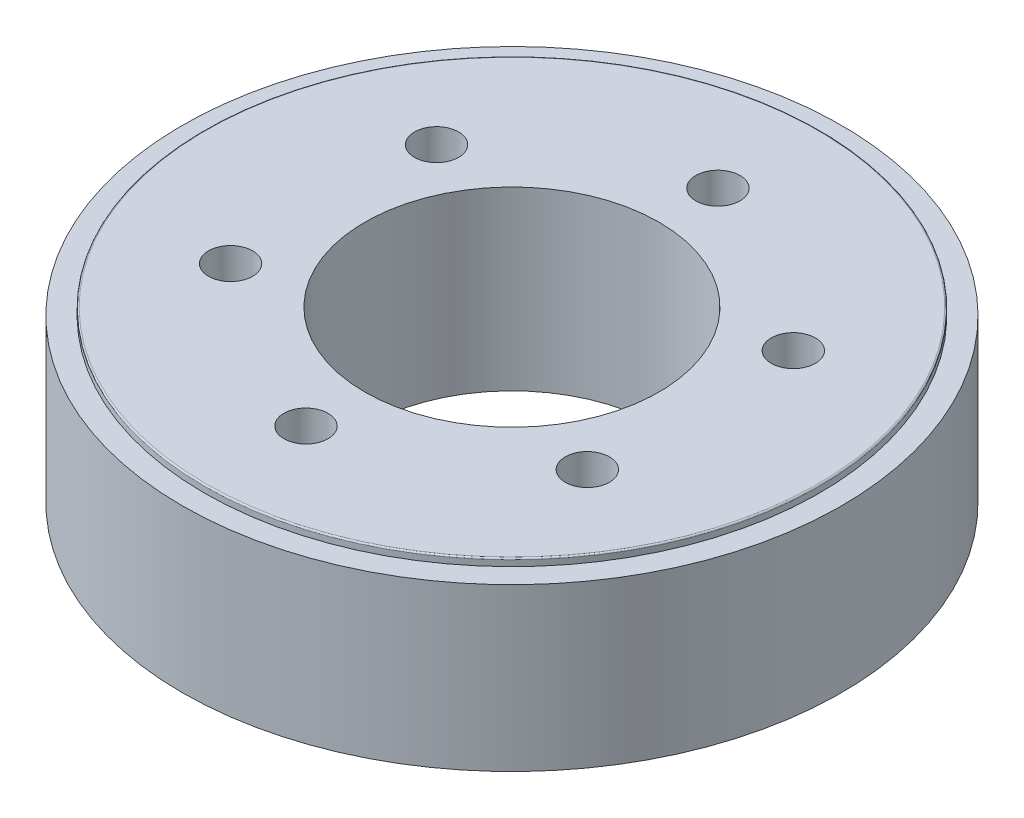
ISO-10303-21;
HEADER;
FILE_DESCRIPTION(('STEP AP214'),'2;1');
FILE_NAME('part.step','',(''),(''),'','','');
FILE_SCHEMA(('AUTOMOTIVE_DESIGN { 1 0 10303 214 1 1 1 1 }'));
ENDSEC;
DATA;
#1=APPLICATION_CONTEXT('core data for automotive mechanical design processes');
#2=APPLICATION_PROTOCOL_DEFINITION('international standard','automotive_design',2000,#1);
#3=PRODUCT_CONTEXT('',#1,'mechanical');
#4=PRODUCT('Part','Part','',(#3));
#5=PRODUCT_RELATED_PRODUCT_CATEGORY('part','',(#4));
#6=PRODUCT_DEFINITION_FORMATION('','',#4);
#7=PRODUCT_DEFINITION_CONTEXT('part definition',#1,'design');
#8=PRODUCT_DEFINITION('design','',#6,#7);
#9=PRODUCT_DEFINITION_SHAPE('','',#8);
#10=(LENGTH_UNIT() NAMED_UNIT(*) SI_UNIT(.MILLI.,.METRE.));
#11=(NAMED_UNIT(*) PLANE_ANGLE_UNIT() SI_UNIT($,.RADIAN.));
#12=(NAMED_UNIT(*) SI_UNIT($,.STERADIAN.) SOLID_ANGLE_UNIT());
#13=UNCERTAINTY_MEASURE_WITH_UNIT(LENGTH_MEASURE(1.E-05),#10,'distance_accuracy_value','');
#14=(GEOMETRIC_REPRESENTATION_CONTEXT(3) GLOBAL_UNCERTAINTY_ASSIGNED_CONTEXT((#13)) GLOBAL_UNIT_ASSIGNED_CONTEXT((#10,
#11,#12)) REPRESENTATION_CONTEXT('',''));
#15=CARTESIAN_POINT('',(0.,0.,0.));
#16=DIRECTION('',(0.,0.,1.));
#17=DIRECTION('',(1.,0.,0.));
#18=AXIS2_PLACEMENT_3D('',#15,#16,#17);
#19=CARTESIAN_POINT('',(0.,12.,0.));
#20=DIRECTION('',(0.,-1.,0.));
#21=DIRECTION('',(0.,0.,-1.));
#22=AXIS2_PLACEMENT_3D('',#19,#20,#21);
#23=CYLINDRICAL_SURFACE('',#22,22.4);
#24=CARTESIAN_POINT('',(0.,11.5,0.));
#25=DIRECTION('',(0.,1.,0.));
#26=DIRECTION('',(0.,0.,1.));
#27=AXIS2_PLACEMENT_3D('',#24,#25,#26);
#28=CIRCLE('',#27,22.4);
#29=CARTESIAN_POINT('',(0.,11.5,22.4));
#30=VERTEX_POINT('',#29);
#31=EDGE_CURVE('E63',#30,#30,#28,.T.);
#32=ORIENTED_EDGE('',*,*,#31,.F.);
#33=EDGE_LOOP('',(#32));
#34=FACE_BOUND('',#33,.T.);
#35=CARTESIAN_POINT('',(0.,0.5,0.));
#36=DIRECTION('',(0.,1.,0.));
#37=DIRECTION('',(0.,0.,1.));
#38=AXIS2_PLACEMENT_3D('',#35,#36,#37);
#39=CIRCLE('',#38,22.4);
#40=CARTESIAN_POINT('',(0.,0.5,22.4));
#41=VERTEX_POINT('',#40);
#42=EDGE_CURVE('E71',#41,#41,#39,.T.);
#43=ORIENTED_EDGE('',*,*,#42,.T.);
#44=EDGE_LOOP('',(#43));
#45=FACE_BOUND('',#44,.T.);
#46=ADVANCED_FACE('F39',(#34,#45),#23,.T.);
#47=CARTESIAN_POINT('',(0.,0.,0.));
#48=DIRECTION('',(0.,1.,0.));
#49=DIRECTION('',(0.,0.,1.));
#50=AXIS2_PLACEMENT_3D('',#47,#48,#49);
#51=PLANE('',#50);
#52=CARTESIAN_POINT('',(0.,0.,-14.));
#53=DIRECTION('',(0.,1.,0.));
#54=DIRECTION('',(0.,0.,1.));
#55=AXIS2_PLACEMENT_3D('',#52,#53,#54);
#56=CIRCLE('',#55,1.5);
#57=CARTESIAN_POINT('',(0.,0.,-12.5));
#58=VERTEX_POINT('',#57);
#59=EDGE_CURVE('E77',#58,#58,#56,.F.);
#60=ORIENTED_EDGE('',*,*,#59,.F.);
#61=EDGE_LOOP('',(#60));
#62=FACE_BOUND('',#61,.T.);
#63=CARTESIAN_POINT('',(12.1243556529822,0.,-6.99999999999997));
#64=DIRECTION('',(0.,1.,0.));
#65=DIRECTION('',(0.,0.,1.));
#66=AXIS2_PLACEMENT_3D('',#63,#64,#65);
#67=CIRCLE('',#66,1.5);
#68=CARTESIAN_POINT('',(12.1243556529822,0.,-5.49999999999998));
#69=VERTEX_POINT('',#68);
#70=EDGE_CURVE('E106',#69,#69,#67,.F.);
#71=ORIENTED_EDGE('',*,*,#70,.F.);
#72=EDGE_LOOP('',(#71));
#73=FACE_BOUND('',#72,.T.);
#74=CARTESIAN_POINT('',(12.1243556529821,0.,7.00000000000006));
#75=DIRECTION('',(0.,1.,0.));
#76=DIRECTION('',(0.,0.,1.));
#77=AXIS2_PLACEMENT_3D('',#74,#75,#76);
#78=CIRCLE('',#77,1.5);
#79=CARTESIAN_POINT('',(12.1243556529821,0.,8.50000000000006));
#80=VERTEX_POINT('',#79);
#81=EDGE_CURVE('E82',#80,#80,#78,.F.);
#82=ORIENTED_EDGE('',*,*,#81,.F.);
#83=EDGE_LOOP('',(#82));
#84=FACE_BOUND('',#83,.T.);
#85=CARTESIAN_POINT('',(0.,0.,14.));
#86=DIRECTION('',(0.,1.,0.));
#87=DIRECTION('',(0.,0.,1.));
#88=AXIS2_PLACEMENT_3D('',#85,#86,#87);
#89=CIRCLE('',#88,1.5);
#90=CARTESIAN_POINT('',(0.,0.,15.5));
#91=VERTEX_POINT('',#90);
#92=EDGE_CURVE('E81',#91,#91,#89,.F.);
#93=ORIENTED_EDGE('',*,*,#92,.F.);
#94=EDGE_LOOP('',(#93));
#95=FACE_BOUND('',#94,.T.);
#96=CARTESIAN_POINT('',(-12.1243556529822,0.,6.99999999999989));
#97=DIRECTION('',(0.,1.,0.));
#98=DIRECTION('',(0.,0.,1.));
#99=AXIS2_PLACEMENT_3D('',#96,#97,#98);
#100=CIRCLE('',#99,1.5);
#101=CARTESIAN_POINT('',(-12.1243556529822,0.,8.49999999999989));
#102=VERTEX_POINT('',#101);
#103=EDGE_CURVE('E89',#102,#102,#100,.F.);
#104=ORIENTED_EDGE('',*,*,#103,.F.);
#105=EDGE_LOOP('',(#104));
#106=FACE_BOUND('',#105,.T.);
#107=CARTESIAN_POINT('',(-12.1243556529821,0.,-7.00000000000014));
#108=DIRECTION('',(0.,1.,0.));
#109=DIRECTION('',(0.,0.,1.));
#110=AXIS2_PLACEMENT_3D('',#107,#108,#109);
#111=CIRCLE('',#110,1.5);
#112=CARTESIAN_POINT('',(-12.1243556529821,0.,-5.50000000000014));
#113=VERTEX_POINT('',#112);
#114=EDGE_CURVE('E95',#113,#113,#111,.F.);
#115=ORIENTED_EDGE('',*,*,#114,.F.);
#116=EDGE_LOOP('',(#115));
#117=FACE_BOUND('',#116,.T.);
#118=CARTESIAN_POINT('',(0.,0.,0.));
#119=DIRECTION('',(0.,1.,0.));
#120=DIRECTION('',(0.,0.,1.));
#121=AXIS2_PLACEMENT_3D('',#118,#119,#120);
#122=CIRCLE('',#121,20.8);
#123=CARTESIAN_POINT('',(0.,0.,20.8));
#124=VERTEX_POINT('',#123);
#125=EDGE_CURVE('E10',#124,#124,#122,.F.);
#126=ORIENTED_EDGE('',*,*,#125,.T.);
#127=EDGE_LOOP('',(#126));
#128=FACE_BOUND('',#127,.T.);
#129=CARTESIAN_POINT('',(0.,0.,0.));
#130=DIRECTION('',(0.,1.,0.));
#131=DIRECTION('',(0.,0.,1.));
#132=AXIS2_PLACEMENT_3D('',#129,#130,#131);
#133=CIRCLE('',#132,10.);
#134=CARTESIAN_POINT('',(0.,0.,10.));
#135=VERTEX_POINT('',#134);
#136=EDGE_CURVE('E60',#135,#135,#133,.T.);
#137=ORIENTED_EDGE('',*,*,#136,.T.);
#138=EDGE_LOOP('',(#137));
#139=FACE_BOUND('',#138,.T.);
#140=ADVANCED_FACE('F120',(#62,#73,#84,#95,#106,#117,#128,#139),#51,.F.);
#141=CARTESIAN_POINT('',(0.,12.,0.));
#142=DIRECTION('',(0.,1.,0.));
#143=DIRECTION('',(0.,0.,1.));
#144=AXIS2_PLACEMENT_3D('',#141,#142,#143);
#145=PLANE('',#144);
#146=CARTESIAN_POINT('',(0.,12.,-14.));
#147=DIRECTION('',(0.,1.,0.));
#148=DIRECTION('',(0.,0.,1.));
#149=AXIS2_PLACEMENT_3D('',#146,#147,#148);
#150=CIRCLE('',#149,1.5);
#151=CARTESIAN_POINT('',(0.,12.,-12.5));
#152=VERTEX_POINT('',#151);
#153=EDGE_CURVE('E101',#152,#152,#150,.T.);
#154=ORIENTED_EDGE('',*,*,#153,.F.);
#155=EDGE_LOOP('',(#154));
#156=FACE_BOUND('',#155,.T.);
#157=CARTESIAN_POINT('',(12.1243556529822,12.,-6.99999999999997));
#158=DIRECTION('',(0.,1.,0.));
#159=DIRECTION('',(0.,0.,1.));
#160=AXIS2_PLACEMENT_3D('',#157,#158,#159);
#161=CIRCLE('',#160,1.5);
#162=CARTESIAN_POINT('',(12.1243556529822,12.,-5.49999999999998));
#163=VERTEX_POINT('',#162);
#164=EDGE_CURVE('E85',#163,#163,#161,.T.);
#165=ORIENTED_EDGE('',*,*,#164,.F.);
#166=EDGE_LOOP('',(#165));
#167=FACE_BOUND('',#166,.T.);
#168=CARTESIAN_POINT('',(12.1243556529821,12.,7.00000000000006));
#169=DIRECTION('',(0.,1.,0.));
#170=DIRECTION('',(0.,0.,1.));
#171=AXIS2_PLACEMENT_3D('',#168,#169,#170);
#172=CIRCLE('',#171,1.5);
#173=CARTESIAN_POINT('',(12.1243556529821,12.,8.50000000000006));
#174=VERTEX_POINT('',#173);
#175=EDGE_CURVE('E78',#174,#174,#172,.T.);
#176=ORIENTED_EDGE('',*,*,#175,.F.);
#177=EDGE_LOOP('',(#176));
#178=FACE_BOUND('',#177,.T.);
#179=CARTESIAN_POINT('',(0.,12.,14.));
#180=DIRECTION('',(0.,1.,0.));
#181=DIRECTION('',(0.,0.,1.));
#182=AXIS2_PLACEMENT_3D('',#179,#180,#181);
#183=CIRCLE('',#182,1.5);
#184=CARTESIAN_POINT('',(0.,12.,15.5));
#185=VERTEX_POINT('',#184);
#186=EDGE_CURVE('E86',#185,#185,#183,.T.);
#187=ORIENTED_EDGE('',*,*,#186,.F.);
#188=EDGE_LOOP('',(#187));
#189=FACE_BOUND('',#188,.T.);
#190=CARTESIAN_POINT('',(-12.1243556529822,12.,6.99999999999989));
#191=DIRECTION('',(0.,1.,0.));
#192=DIRECTION('',(0.,0.,1.));
#193=AXIS2_PLACEMENT_3D('',#190,#191,#192);
#194=CIRCLE('',#193,1.5);
#195=CARTESIAN_POINT('',(-12.1243556529822,12.,8.49999999999989));
#196=VERTEX_POINT('',#195);
#197=EDGE_CURVE('E92',#196,#196,#194,.T.);
#198=ORIENTED_EDGE('',*,*,#197,.F.);
#199=EDGE_LOOP('',(#198));
#200=FACE_BOUND('',#199,.T.);
#201=CARTESIAN_POINT('',(-12.1243556529821,12.,-7.00000000000014));
#202=DIRECTION('',(0.,1.,0.));
#203=DIRECTION('',(0.,0.,1.));
#204=AXIS2_PLACEMENT_3D('',#201,#202,#203);
#205=CIRCLE('',#204,1.5);
#206=CARTESIAN_POINT('',(-12.1243556529821,12.,-5.50000000000014));
#207=VERTEX_POINT('',#206);
#208=EDGE_CURVE('E98',#207,#207,#205,.T.);
#209=ORIENTED_EDGE('',*,*,#208,.F.);
#210=EDGE_LOOP('',(#209));
#211=FACE_BOUND('',#210,.T.);
#212=CARTESIAN_POINT('',(0.,12.,0.));
#213=DIRECTION('',(0.,1.,0.));
#214=DIRECTION('',(0.,0.,1.));
#215=AXIS2_PLACEMENT_3D('',#212,#213,#214);
#216=CIRCLE('',#215,20.8);
#217=CARTESIAN_POINT('',(0.,12.,20.8));
#218=VERTEX_POINT('',#217);
#219=EDGE_CURVE('E54',#218,#218,#216,.T.);
#220=ORIENTED_EDGE('',*,*,#219,.T.);
#221=EDGE_LOOP('',(#220));
#222=FACE_BOUND('',#221,.T.);
#223=CARTESIAN_POINT('',(0.,12.,0.));
#224=DIRECTION('',(0.,1.,0.));
#225=DIRECTION('',(0.,0.,1.));
#226=AXIS2_PLACEMENT_3D('',#223,#224,#225);
#227=CIRCLE('',#226,10.);
#228=CARTESIAN_POINT('',(0.,12.,10.));
#229=VERTEX_POINT('',#228);
#230=EDGE_CURVE('E59',#229,#229,#227,.T.);
#231=ORIENTED_EDGE('',*,*,#230,.F.);
#232=EDGE_LOOP('',(#231));
#233=FACE_BOUND('',#232,.T.);
#234=ADVANCED_FACE('F116',(#156,#167,#178,#189,#200,#211,#222,#233),#145,.T.);
#235=CARTESIAN_POINT('',(0.,12.,0.));
#236=DIRECTION('',(0.,-1.,0.));
#237=DIRECTION('',(0.,0.,-1.));
#238=AXIS2_PLACEMENT_3D('',#235,#236,#237);
#239=CYLINDRICAL_SURFACE('',#238,10.);
#240=ORIENTED_EDGE('',*,*,#230,.T.);
#241=EDGE_LOOP('',(#240));
#242=FACE_BOUND('',#241,.T.);
#243=ORIENTED_EDGE('',*,*,#136,.F.);
#244=EDGE_LOOP('',(#243));
#245=FACE_BOUND('',#244,.T.);
#246=ADVANCED_FACE('F119',(#242,#245),#239,.F.);
#247=CARTESIAN_POINT('',(0.,11.5,0.));
#248=DIRECTION('',(0.,1.,0.));
#249=DIRECTION('',(0.,0.,1.));
#250=AXIS2_PLACEMENT_3D('',#247,#248,#249);
#251=PLANE('',#250);
#252=CARTESIAN_POINT('',(0.,11.5,0.));
#253=DIRECTION('',(0.,1.,0.));
#254=DIRECTION('',(0.,0.,1.));
#255=AXIS2_PLACEMENT_3D('',#252,#253,#254);
#256=CIRCLE('',#255,20.9);
#257=CARTESIAN_POINT('',(0.,11.5,20.9));
#258=VERTEX_POINT('',#257);
#259=EDGE_CURVE('E68',#258,#258,#256,.T.);
#260=ORIENTED_EDGE('',*,*,#259,.F.);
#261=EDGE_LOOP('',(#260));
#262=FACE_BOUND('',#261,.T.);
#263=ORIENTED_EDGE('',*,*,#31,.T.);
#264=EDGE_LOOP('',(#263));
#265=FACE_BOUND('',#264,.T.);
#266=ADVANCED_FACE('F138',(#262,#265),#251,.T.);
#267=CARTESIAN_POINT('',(0.,11.5,0.));
#268=DIRECTION('',(0.,1.,0.));
#269=DIRECTION('',(0.,0.,1.));
#270=AXIS2_PLACEMENT_3D('',#267,#268,#269);
#271=CYLINDRICAL_SURFACE('',#270,20.9);
#272=CARTESIAN_POINT('',(0.,11.9,0.));
#273=DIRECTION('',(0.,1.,0.));
#274=DIRECTION('',(0.,0.,1.));
#275=AXIS2_PLACEMENT_3D('',#272,#273,#274);
#276=CIRCLE('',#275,20.9);
#277=CARTESIAN_POINT('',(0.,11.9,20.9));
#278=VERTEX_POINT('',#277);
#279=EDGE_CURVE('E50',#278,#278,#276,.F.);
#280=ORIENTED_EDGE('',*,*,#279,.T.);
#281=EDGE_LOOP('',(#280));
#282=FACE_BOUND('',#281,.T.);
#283=ORIENTED_EDGE('',*,*,#259,.T.);
#284=EDGE_LOOP('',(#283));
#285=FACE_BOUND('',#284,.T.);
#286=ADVANCED_FACE('F156',(#282,#285),#271,.T.);
#287=CARTESIAN_POINT('',(0.,11.9,0.));
#288=DIRECTION('',(0.,1.,0.));
#289=DIRECTION('',(0.,0.,1.));
#290=AXIS2_PLACEMENT_3D('',#287,#288,#289);
#291=TOROIDAL_SURFACE('',#290,20.8,0.1);
#292=ORIENTED_EDGE('',*,*,#279,.F.);
#293=EDGE_LOOP('',(#292));
#294=FACE_BOUND('',#293,.T.);
#295=ORIENTED_EDGE('',*,*,#219,.F.);
#296=EDGE_LOOP('',(#295));
#297=FACE_BOUND('',#296,.T.);
#298=ADVANCED_FACE('F153',(#294,#297),#291,.T.);
#299=CARTESIAN_POINT('',(0.,0.5,0.));
#300=DIRECTION('',(0.,-1.,0.));
#301=DIRECTION('',(0.,0.,1.));
#302=AXIS2_PLACEMENT_3D('',#299,#300,#301);
#303=PLANE('',#302);
#304=ORIENTED_EDGE('',*,*,#42,.F.);
#305=EDGE_LOOP('',(#304));
#306=FACE_BOUND('',#305,.T.);
#307=CARTESIAN_POINT('',(0.,0.5,0.));
#308=DIRECTION('',(0.,1.,0.));
#309=DIRECTION('',(0.,0.,1.));
#310=AXIS2_PLACEMENT_3D('',#307,#308,#309);
#311=CIRCLE('',#310,20.9);
#312=CARTESIAN_POINT('',(0.,0.5,20.9));
#313=VERTEX_POINT('',#312);
#314=EDGE_CURVE('E74',#313,#313,#311,.T.);
#315=ORIENTED_EDGE('',*,*,#314,.T.);
#316=EDGE_LOOP('',(#315));
#317=FACE_BOUND('',#316,.T.);
#318=ADVANCED_FACE('F155',(#306,#317),#303,.T.);
#319=CARTESIAN_POINT('',(0.,0.5,0.));
#320=DIRECTION('',(0.,-1.,0.));
#321=DIRECTION('',(0.,0.,-1.));
#322=AXIS2_PLACEMENT_3D('',#319,#320,#321);
#323=CYLINDRICAL_SURFACE('',#322,20.9);
#324=CARTESIAN_POINT('',(0.,0.1,0.));
#325=DIRECTION('',(0.,1.,0.));
#326=DIRECTION('',(0.,0.,1.));
#327=AXIS2_PLACEMENT_3D('',#324,#325,#326);
#328=CIRCLE('',#327,20.9);
#329=CARTESIAN_POINT('',(0.,0.1,20.9));
#330=VERTEX_POINT('',#329);
#331=EDGE_CURVE('E46',#330,#330,#328,.T.);
#332=ORIENTED_EDGE('',*,*,#331,.T.);
#333=EDGE_LOOP('',(#332));
#334=FACE_BOUND('',#333,.T.);
#335=ORIENTED_EDGE('',*,*,#314,.F.);
#336=EDGE_LOOP('',(#335));
#337=FACE_BOUND('',#336,.T.);
#338=ADVANCED_FACE('F162',(#334,#337),#323,.T.);
#339=CARTESIAN_POINT('',(0.,0.1,0.));
#340=DIRECTION('',(0.,1.,0.));
#341=DIRECTION('',(0.,0.,1.));
#342=AXIS2_PLACEMENT_3D('',#339,#340,#341);
#343=TOROIDAL_SURFACE('',#342,20.8,0.1);
#344=ORIENTED_EDGE('',*,*,#125,.F.);
#345=EDGE_LOOP('',(#344));
#346=FACE_BOUND('',#345,.T.);
#347=ORIENTED_EDGE('',*,*,#331,.F.);
#348=EDGE_LOOP('',(#347));
#349=FACE_BOUND('',#348,.T.);
#350=ADVANCED_FACE('F41',(#346,#349),#343,.T.);
#351=CARTESIAN_POINT('',(-12.1243556529821,-4.24264068711928,-7.00000000000014));
#352=DIRECTION('',(0.,1.,0.));
#353=DIRECTION('',(0.,0.,1.));
#354=AXIS2_PLACEMENT_3D('',#351,#352,#353);
#355=CYLINDRICAL_SURFACE('',#354,1.5);
#356=ORIENTED_EDGE('',*,*,#114,.T.);
#357=EDGE_LOOP('',(#356));
#358=FACE_BOUND('',#357,.T.);
#359=ORIENTED_EDGE('',*,*,#208,.T.);
#360=EDGE_LOOP('',(#359));
#361=FACE_BOUND('',#360,.T.);
#362=ADVANCED_FACE('F185',(#358,#361),#355,.F.);
#363=CARTESIAN_POINT('',(-12.1243556529822,-4.24264068711928,6.99999999999989));
#364=DIRECTION('',(0.,1.,0.));
#365=DIRECTION('',(0.,0.,1.));
#366=AXIS2_PLACEMENT_3D('',#363,#364,#365);
#367=CYLINDRICAL_SURFACE('',#366,1.5);
#368=ORIENTED_EDGE('',*,*,#103,.T.);
#369=EDGE_LOOP('',(#368));
#370=FACE_BOUND('',#369,.T.);
#371=ORIENTED_EDGE('',*,*,#197,.T.);
#372=EDGE_LOOP('',(#371));
#373=FACE_BOUND('',#372,.T.);
#374=ADVANCED_FACE('F196',(#370,#373),#367,.F.);
#375=CARTESIAN_POINT('',(0.,-4.24264068711928,14.));
#376=DIRECTION('',(0.,1.,0.));
#377=DIRECTION('',(0.,0.,1.));
#378=AXIS2_PLACEMENT_3D('',#375,#376,#377);
#379=CYLINDRICAL_SURFACE('',#378,1.5);
#380=ORIENTED_EDGE('',*,*,#92,.T.);
#381=EDGE_LOOP('',(#380));
#382=FACE_BOUND('',#381,.T.);
#383=ORIENTED_EDGE('',*,*,#186,.T.);
#384=EDGE_LOOP('',(#383));
#385=FACE_BOUND('',#384,.T.);
#386=ADVANCED_FACE('F192',(#382,#385),#379,.F.);
#387=CARTESIAN_POINT('',(12.1243556529821,-4.24264068711928,7.00000000000006));
#388=DIRECTION('',(0.,1.,0.));
#389=DIRECTION('',(0.,0.,1.));
#390=AXIS2_PLACEMENT_3D('',#387,#388,#389);
#391=CYLINDRICAL_SURFACE('',#390,1.5);
#392=ORIENTED_EDGE('',*,*,#81,.T.);
#393=EDGE_LOOP('',(#392));
#394=FACE_BOUND('',#393,.T.);
#395=ORIENTED_EDGE('',*,*,#175,.T.);
#396=EDGE_LOOP('',(#395));
#397=FACE_BOUND('',#396,.T.);
#398=ADVANCED_FACE('F188',(#394,#397),#391,.F.);
#399=CARTESIAN_POINT('',(12.1243556529822,-4.24264068711928,-6.99999999999997));
#400=DIRECTION('',(0.,1.,0.));
#401=DIRECTION('',(0.,0.,1.));
#402=AXIS2_PLACEMENT_3D('',#399,#400,#401);
#403=CYLINDRICAL_SURFACE('',#402,1.5);
#404=ORIENTED_EDGE('',*,*,#70,.T.);
#405=EDGE_LOOP('',(#404));
#406=FACE_BOUND('',#405,.T.);
#407=ORIENTED_EDGE('',*,*,#164,.T.);
#408=EDGE_LOOP('',(#407));
#409=FACE_BOUND('',#408,.T.);
#410=ADVANCED_FACE('F191',(#406,#409),#403,.F.);
#411=CARTESIAN_POINT('',(0.,-4.24264068711928,-14.));
#412=DIRECTION('',(0.,1.,0.));
#413=DIRECTION('',(0.,0.,1.));
#414=AXIS2_PLACEMENT_3D('',#411,#412,#413);
#415=CYLINDRICAL_SURFACE('',#414,1.5);
#416=ORIENTED_EDGE('',*,*,#59,.T.);
#417=EDGE_LOOP('',(#416));
#418=FACE_BOUND('',#417,.T.);
#419=ORIENTED_EDGE('',*,*,#153,.T.);
#420=EDGE_LOOP('',(#419));
#421=FACE_BOUND('',#420,.T.);
#422=ADVANCED_FACE('F114',(#418,#421),#415,.F.);
#423=CLOSED_SHELL('',(#46,#140,#234,#246,#266,#286,#298,#318,#338,#350,#362,#374,#386,#398,#410,#422));
#424=MANIFOLD_SOLID_BREP('B2',#423);
#425=ADVANCED_BREP_SHAPE_REPRESENTATION('',(#18,#424),#14);
#426=SHAPE_DEFINITION_REPRESENTATION(#9,#425);
ENDSEC;
END-ISO-10303-21;
